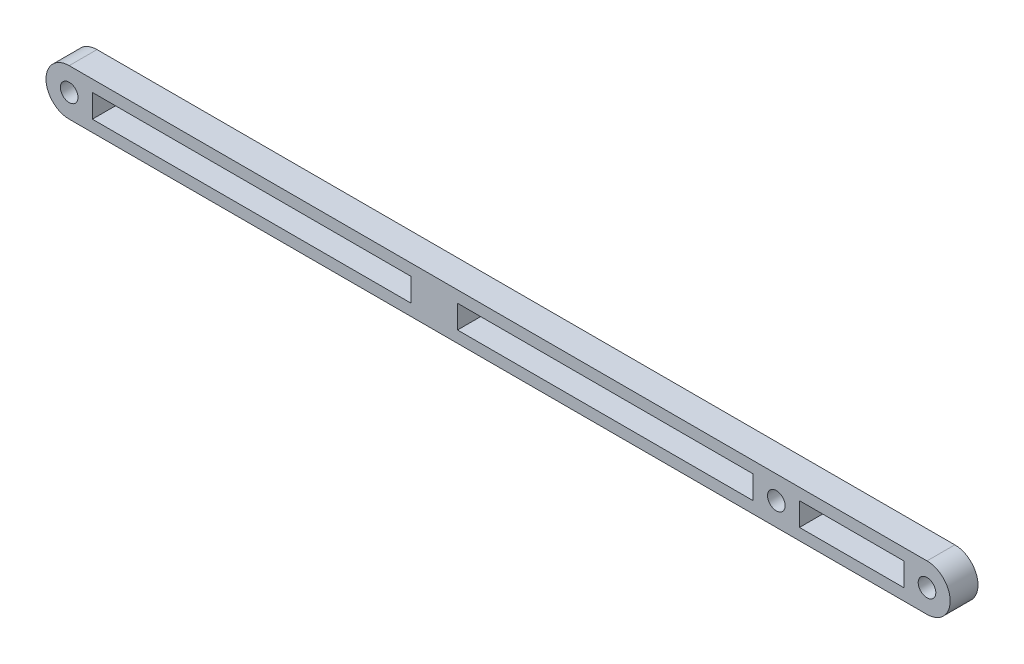
ISO-10303-21;
HEADER;
FILE_DESCRIPTION(('STEP AP214'),'2;1');
FILE_NAME('part.step','',(''),(''),'','','');
FILE_SCHEMA(('AUTOMOTIVE_DESIGN { 1 0 10303 214 1 1 1 1 }'));
ENDSEC;
DATA;
#1=APPLICATION_CONTEXT('core data for automotive mechanical design processes');
#2=APPLICATION_PROTOCOL_DEFINITION('international standard','automotive_design',2000,#1);
#3=PRODUCT_CONTEXT('',#1,'mechanical');
#4=PRODUCT('Part','Part','',(#3));
#5=PRODUCT_RELATED_PRODUCT_CATEGORY('part','',(#4));
#6=PRODUCT_DEFINITION_FORMATION('','',#4);
#7=PRODUCT_DEFINITION_CONTEXT('part definition',#1,'design');
#8=PRODUCT_DEFINITION('design','',#6,#7);
#9=PRODUCT_DEFINITION_SHAPE('','',#8);
#10=(LENGTH_UNIT() NAMED_UNIT(*) SI_UNIT(.MILLI.,.METRE.));
#11=(NAMED_UNIT(*) PLANE_ANGLE_UNIT() SI_UNIT($,.RADIAN.));
#12=(NAMED_UNIT(*) SI_UNIT($,.STERADIAN.) SOLID_ANGLE_UNIT());
#13=UNCERTAINTY_MEASURE_WITH_UNIT(LENGTH_MEASURE(1.E-05),#10,'distance_accuracy_value','');
#14=(GEOMETRIC_REPRESENTATION_CONTEXT(3) GLOBAL_UNCERTAINTY_ASSIGNED_CONTEXT((#13)) GLOBAL_UNIT_ASSIGNED_CONTEXT((#10,
#11,#12)) REPRESENTATION_CONTEXT('',''));
#15=CARTESIAN_POINT('',(0.,0.,0.));
#16=DIRECTION('',(0.,0.,1.));
#17=DIRECTION('',(1.,0.,0.));
#18=AXIS2_PLACEMENT_3D('',#15,#16,#17);
#19=CARTESIAN_POINT('',(-87.5,-2.49999999999997,0.));
#20=DIRECTION('',(0.,-1.,0.));
#21=DIRECTION('',(0.,0.,-1.));
#22=AXIS2_PLACEMENT_3D('',#19,#20,#21);
#23=PLANE('',#22);
#24=DIRECTION('',(1.,0.,0.));
#25=VECTOR('',#24,1.);
#26=CARTESIAN_POINT('',(-87.5,-2.49999999999997,6.));
#27=LINE('',#26,#25);
#28=CARTESIAN_POINT('',(-87.5,-2.49999999999997,6.));
#29=VERTEX_POINT('',#28);
#30=CARTESIAN_POINT('',(-18.75,-2.49999999999997,6.));
#31=VERTEX_POINT('',#30);
#32=EDGE_CURVE('E168',#29,#31,#27,.T.);
#33=ORIENTED_EDGE('',*,*,#32,.T.);
#34=DIRECTION('',(0.,0.,1.));
#35=VECTOR('',#34,1.);
#36=CARTESIAN_POINT('',(-18.75,-2.49999999999997,0.));
#37=LINE('',#36,#35);
#38=CARTESIAN_POINT('',(-18.75,-2.49999999999997,0.));
#39=VERTEX_POINT('',#38);
#40=EDGE_CURVE('E67',#39,#31,#37,.T.);
#41=ORIENTED_EDGE('',*,*,#40,.F.);
#42=DIRECTION('',(1.,0.,0.));
#43=VECTOR('',#42,1.);
#44=CARTESIAN_POINT('',(-87.5,-2.49999999999997,0.));
#45=LINE('',#44,#43);
#46=CARTESIAN_POINT('',(-87.5,-2.49999999999997,0.));
#47=VERTEX_POINT('',#46);
#48=EDGE_CURVE('E216',#47,#39,#45,.T.);
#49=ORIENTED_EDGE('',*,*,#48,.F.);
#50=DIRECTION('',(0.,0.,1.));
#51=VECTOR('',#50,1.);
#52=CARTESIAN_POINT('',(-87.5,-2.49999999999997,0.));
#53=LINE('',#52,#51);
#54=EDGE_CURVE('E235',#47,#29,#53,.T.);
#55=ORIENTED_EDGE('',*,*,#54,.T.);
#56=EDGE_LOOP('',(#33,#41,#49,#55));
#57=FACE_BOUND('',#56,.T.);
#58=ADVANCED_FACE('F43',(#57),#23,.F.);
#59=CARTESIAN_POINT('',(-87.5,2.50000000000003,0.));
#60=DIRECTION('',(0.,1.,0.));
#61=DIRECTION('',(0.,0.,1.));
#62=AXIS2_PLACEMENT_3D('',#59,#60,#61);
#63=PLANE('',#62);
#64=DIRECTION('',(-1.,0.,0.));
#65=VECTOR('',#64,1.);
#66=CARTESIAN_POINT('',(-87.5,2.50000000000003,0.));
#67=LINE('',#66,#65);
#68=CARTESIAN_POINT('',(-18.75,2.50000000000003,0.));
#69=VERTEX_POINT('',#68);
#70=CARTESIAN_POINT('',(-87.5,2.50000000000003,0.));
#71=VERTEX_POINT('',#70);
#72=EDGE_CURVE('E207',#69,#71,#67,.T.);
#73=ORIENTED_EDGE('',*,*,#72,.F.);
#74=DIRECTION('',(0.,0.,1.));
#75=VECTOR('',#74,1.);
#76=CARTESIAN_POINT('',(-18.75,2.50000000000003,0.));
#77=LINE('',#76,#75);
#78=CARTESIAN_POINT('',(-18.75,2.50000000000003,6.));
#79=VERTEX_POINT('',#78);
#80=EDGE_CURVE('E194',#69,#79,#77,.T.);
#81=ORIENTED_EDGE('',*,*,#80,.T.);
#82=DIRECTION('',(-1.,0.,0.));
#83=VECTOR('',#82,1.);
#84=CARTESIAN_POINT('',(-87.5,2.50000000000003,6.));
#85=LINE('',#84,#83);
#86=CARTESIAN_POINT('',(-87.5,2.50000000000003,6.));
#87=VERTEX_POINT('',#86);
#88=EDGE_CURVE('E222',#79,#87,#85,.T.);
#89=ORIENTED_EDGE('',*,*,#88,.T.);
#90=DIRECTION('',(0.,0.,1.));
#91=VECTOR('',#90,1.);
#92=CARTESIAN_POINT('',(-87.5,2.50000000000003,0.));
#93=LINE('',#92,#91);
#94=EDGE_CURVE('E238',#71,#87,#93,.T.);
#95=ORIENTED_EDGE('',*,*,#94,.F.);
#96=EDGE_LOOP('',(#73,#81,#89,#95));
#97=FACE_BOUND('',#96,.T.);
#98=ADVANCED_FACE('F374',(#97),#63,.F.);
#99=CARTESIAN_POINT('',(92.5,0.,6.));
#100=DIRECTION('',(0.,0.,-1.));
#101=DIRECTION('',(-1.,0.,0.));
#102=AXIS2_PLACEMENT_3D('',#99,#100,#101);
#103=PLANE('',#102);
#104=CARTESIAN_POINT('',(-8.74999999999999,-2.49999999999997,6.));
#105=VERTEX_POINT('',#104);
#106=CARTESIAN_POINT('',(55.,-2.49999999999997,6.));
#107=VERTEX_POINT('',#106);
#108=EDGE_CURVE('E159',#105,#107,#27,.T.);
#109=ORIENTED_EDGE('',*,*,#108,.F.);
#110=DIRECTION('',(0.,1.,0.));
#111=VECTOR('',#110,1.);
#112=CARTESIAN_POINT('',(-8.75,2.50000000000003,6.));
#113=LINE('',#112,#111);
#114=CARTESIAN_POINT('',(-8.74999999999999,2.50000000000003,6.));
#115=VERTEX_POINT('',#114);
#116=EDGE_CURVE('E164',#105,#115,#113,.T.);
#117=ORIENTED_EDGE('',*,*,#116,.T.);
#118=CARTESIAN_POINT('',(55.,2.50000000000003,6.));
#119=VERTEX_POINT('',#118);
#120=EDGE_CURVE('E224',#119,#115,#85,.T.);
#121=ORIENTED_EDGE('',*,*,#120,.F.);
#122=DIRECTION('',(0.,1.,0.));
#123=VECTOR('',#122,1.);
#124=CARTESIAN_POINT('',(55.,-2.49999999999997,6.));
#125=LINE('',#124,#123);
#126=EDGE_CURVE('E165',#107,#119,#125,.T.);
#127=ORIENTED_EDGE('',*,*,#126,.F.);
#128=EDGE_LOOP('',(#109,#117,#121,#127));
#129=FACE_BOUND('',#128,.T.);
#130=DIRECTION('',(0.,-1.,0.));
#131=VECTOR('',#130,1.);
#132=CARTESIAN_POINT('',(-18.75,2.50000000000003,6.));
#133=LINE('',#132,#131);
#134=EDGE_CURVE('E183',#79,#31,#133,.T.);
#135=ORIENTED_EDGE('',*,*,#134,.T.);
#136=ORIENTED_EDGE('',*,*,#32,.F.);
#137=DIRECTION('',(0.,-1.,0.));
#138=VECTOR('',#137,1.);
#139=CARTESIAN_POINT('',(-87.5,-2.49999999999997,6.));
#140=LINE('',#139,#138);
#141=EDGE_CURVE('E169',#87,#29,#140,.T.);
#142=ORIENTED_EDGE('',*,*,#141,.F.);
#143=ORIENTED_EDGE('',*,*,#88,.F.);
#144=EDGE_LOOP('',(#135,#136,#142,#143));
#145=FACE_BOUND('',#144,.T.);
#146=DIRECTION('',(-1.,0.,0.));
#147=VECTOR('',#146,1.);
#148=CARTESIAN_POINT('',(65.,2.50000000000003,6.));
#149=LINE('',#148,#147);
#150=CARTESIAN_POINT('',(87.5,2.50000000000003,6.));
#151=VERTEX_POINT('',#150);
#152=CARTESIAN_POINT('',(65.,2.50000000000003,6.));
#153=VERTEX_POINT('',#152);
#154=EDGE_CURVE('E267',#151,#153,#149,.T.);
#155=ORIENTED_EDGE('',*,*,#154,.F.);
#156=DIRECTION('',(0.,1.,0.));
#157=VECTOR('',#156,1.);
#158=CARTESIAN_POINT('',(87.5,-2.49999999999997,6.));
#159=LINE('',#158,#157);
#160=CARTESIAN_POINT('',(87.5,-2.49999999999997,6.));
#161=VERTEX_POINT('',#160);
#162=EDGE_CURVE('E223',#161,#151,#159,.T.);
#163=ORIENTED_EDGE('',*,*,#162,.F.);
#164=DIRECTION('',(1.,0.,0.));
#165=VECTOR('',#164,1.);
#166=CARTESIAN_POINT('',(65.,-2.49999999999997,6.));
#167=LINE('',#166,#165);
#168=CARTESIAN_POINT('',(65.,-2.49999999999997,6.));
#169=VERTEX_POINT('',#168);
#170=EDGE_CURVE('E258',#169,#161,#167,.T.);
#171=ORIENTED_EDGE('',*,*,#170,.F.);
#172=DIRECTION('',(0.,-1.,0.));
#173=VECTOR('',#172,1.);
#174=CARTESIAN_POINT('',(65.,-2.49999999999997,6.));
#175=LINE('',#174,#173);
#176=EDGE_CURVE('E262',#153,#169,#175,.T.);
#177=ORIENTED_EDGE('',*,*,#176,.F.);
#178=EDGE_LOOP('',(#155,#163,#171,#177));
#179=FACE_BOUND('',#178,.T.);
#180=CARTESIAN_POINT('',(92.5,0.,6.));
#181=DIRECTION('',(0.,0.,1.));
#182=DIRECTION('',(-1.,0.,0.));
#183=AXIS2_PLACEMENT_3D('',#180,#181,#182);
#184=CIRCLE('',#183,5.00000000000003);
#185=CARTESIAN_POINT('',(92.5,-5.00000000000003,6.));
#186=VERTEX_POINT('',#185);
#187=CARTESIAN_POINT('',(92.5,5.00000000000003,6.));
#188=VERTEX_POINT('',#187);
#189=EDGE_CURVE('E311',#186,#188,#184,.T.);
#190=ORIENTED_EDGE('',*,*,#189,.T.);
#191=DIRECTION('',(-1.,0.,0.));
#192=VECTOR('',#191,1.);
#193=CARTESIAN_POINT('',(-92.5,5.,6.));
#194=LINE('',#193,#192);
#195=CARTESIAN_POINT('',(-92.5,5.00000000000001,6.));
#196=VERTEX_POINT('',#195);
#197=EDGE_CURVE('E315',#188,#196,#194,.T.);
#198=ORIENTED_EDGE('',*,*,#197,.T.);
#199=CARTESIAN_POINT('',(-92.5,0.,6.));
#200=DIRECTION('',(0.,0.,1.));
#201=DIRECTION('',(1.,0.,0.));
#202=AXIS2_PLACEMENT_3D('',#199,#200,#201);
#203=CIRCLE('',#202,5.00000000000003);
#204=CARTESIAN_POINT('',(-92.5,-5.00000000000007,6.));
#205=VERTEX_POINT('',#204);
#206=EDGE_CURVE('E319',#196,#205,#203,.T.);
#207=ORIENTED_EDGE('',*,*,#206,.T.);
#208=DIRECTION('',(1.,0.,0.));
#209=VECTOR('',#208,1.);
#210=CARTESIAN_POINT('',(-92.5,-5.00000000000007,6.));
#211=LINE('',#210,#209);
#212=EDGE_CURVE('E322',#205,#186,#211,.T.);
#213=ORIENTED_EDGE('',*,*,#212,.T.);
#214=EDGE_LOOP('',(#190,#198,#207,#213));
#215=FACE_BOUND('',#214,.T.);
#216=CARTESIAN_POINT('',(-92.5,0.,6.));
#217=DIRECTION('',(0.,0.,1.));
#218=DIRECTION('',(1.,0.,0.));
#219=AXIS2_PLACEMENT_3D('',#216,#217,#218);
#220=CIRCLE('',#219,1.9);
#221=CARTESIAN_POINT('',(-90.6,0.,6.));
#222=VERTEX_POINT('',#221);
#223=EDGE_CURVE('E303',#222,#222,#220,.T.);
#224=ORIENTED_EDGE('',*,*,#223,.F.);
#225=EDGE_LOOP('',(#224));
#226=FACE_BOUND('',#225,.T.);
#227=CARTESIAN_POINT('',(92.5,0.,6.));
#228=DIRECTION('',(0.,0.,1.));
#229=DIRECTION('',(1.,0.,0.));
#230=AXIS2_PLACEMENT_3D('',#227,#228,#229);
#231=CIRCLE('',#230,1.9);
#232=CARTESIAN_POINT('',(94.4,0.,6.));
#233=VERTEX_POINT('',#232);
#234=EDGE_CURVE('E295',#233,#233,#231,.T.);
#235=ORIENTED_EDGE('',*,*,#234,.F.);
#236=EDGE_LOOP('',(#235));
#237=FACE_BOUND('',#236,.T.);
#238=CARTESIAN_POINT('',(60.,0.,6.));
#239=DIRECTION('',(0.,0.,1.));
#240=DIRECTION('',(1.,0.,0.));
#241=AXIS2_PLACEMENT_3D('',#238,#239,#240);
#242=CIRCLE('',#241,1.9);
#243=CARTESIAN_POINT('',(61.9,0.,6.));
#244=VERTEX_POINT('',#243);
#245=EDGE_CURVE('E287',#244,#244,#242,.T.);
#246=ORIENTED_EDGE('',*,*,#245,.F.);
#247=EDGE_LOOP('',(#246));
#248=FACE_BOUND('',#247,.T.);
#249=ADVANCED_FACE('F160',(#129,#145,#179,#215,#226,#237,#248),#103,.F.);
#250=CARTESIAN_POINT('',(92.5,0.,0.));
#251=DIRECTION('',(0.,0.,-1.));
#252=DIRECTION('',(-1.,0.,0.));
#253=AXIS2_PLACEMENT_3D('',#250,#251,#252);
#254=PLANE('',#253);
#255=DIRECTION('',(0.,1.,0.));
#256=VECTOR('',#255,1.);
#257=CARTESIAN_POINT('',(-8.75,2.50000000000003,0.));
#258=LINE('',#257,#256);
#259=CARTESIAN_POINT('',(-8.74999999999999,-2.49999999999997,0.));
#260=VERTEX_POINT('',#259);
#261=CARTESIAN_POINT('',(-8.74999999999999,2.50000000000003,0.));
#262=VERTEX_POINT('',#261);
#263=EDGE_CURVE('E188',#260,#262,#258,.T.);
#264=ORIENTED_EDGE('',*,*,#263,.F.);
#265=CARTESIAN_POINT('',(55.,-2.49999999999997,0.));
#266=VERTEX_POINT('',#265);
#267=EDGE_CURVE('E59',#260,#266,#45,.T.);
#268=ORIENTED_EDGE('',*,*,#267,.T.);
#269=DIRECTION('',(0.,1.,0.));
#270=VECTOR('',#269,1.);
#271=CARTESIAN_POINT('',(55.,-2.49999999999997,0.));
#272=LINE('',#271,#270);
#273=CARTESIAN_POINT('',(55.,2.50000000000003,0.));
#274=VERTEX_POINT('',#273);
#275=EDGE_CURVE('E203',#266,#274,#272,.T.);
#276=ORIENTED_EDGE('',*,*,#275,.T.);
#277=EDGE_CURVE('E208',#274,#262,#67,.T.);
#278=ORIENTED_EDGE('',*,*,#277,.T.);
#279=EDGE_LOOP('',(#264,#268,#276,#278));
#280=FACE_BOUND('',#279,.T.);
#281=ORIENTED_EDGE('',*,*,#48,.T.);
#282=DIRECTION('',(0.,-1.,0.));
#283=VECTOR('',#282,1.);
#284=CARTESIAN_POINT('',(-18.75,2.50000000000003,0.));
#285=LINE('',#284,#283);
#286=EDGE_CURVE('E182',#69,#39,#285,.T.);
#287=ORIENTED_EDGE('',*,*,#286,.F.);
#288=ORIENTED_EDGE('',*,*,#72,.T.);
#289=DIRECTION('',(0.,-1.,0.));
#290=VECTOR('',#289,1.);
#291=CARTESIAN_POINT('',(-87.5,-2.49999999999997,0.));
#292=LINE('',#291,#290);
#293=EDGE_CURVE('E212',#71,#47,#292,.T.);
#294=ORIENTED_EDGE('',*,*,#293,.T.);
#295=EDGE_LOOP('',(#281,#287,#288,#294));
#296=FACE_BOUND('',#295,.T.);
#297=DIRECTION('',(0.,1.,0.));
#298=VECTOR('',#297,1.);
#299=CARTESIAN_POINT('',(87.5,-2.49999999999997,0.));
#300=LINE('',#299,#298);
#301=CARTESIAN_POINT('',(87.5,-2.49999999999997,0.));
#302=VERTEX_POINT('',#301);
#303=CARTESIAN_POINT('',(87.5,2.50000000000003,0.));
#304=VERTEX_POINT('',#303);
#305=EDGE_CURVE('E263',#302,#304,#300,.T.);
#306=ORIENTED_EDGE('',*,*,#305,.T.);
#307=DIRECTION('',(-1.,0.,0.));
#308=VECTOR('',#307,1.);
#309=CARTESIAN_POINT('',(65.,2.50000000000003,0.));
#310=LINE('',#309,#308);
#311=CARTESIAN_POINT('',(65.,2.50000000000003,0.));
#312=VERTEX_POINT('',#311);
#313=EDGE_CURVE('E280',#304,#312,#310,.T.);
#314=ORIENTED_EDGE('',*,*,#313,.T.);
#315=DIRECTION('',(0.,-1.,0.));
#316=VECTOR('',#315,1.);
#317=CARTESIAN_POINT('',(65.,-2.49999999999997,0.));
#318=LINE('',#317,#316);
#319=CARTESIAN_POINT('',(65.,-2.49999999999997,0.));
#320=VERTEX_POINT('',#319);
#321=EDGE_CURVE('E276',#312,#320,#318,.T.);
#322=ORIENTED_EDGE('',*,*,#321,.T.);
#323=DIRECTION('',(1.,0.,0.));
#324=VECTOR('',#323,1.);
#325=CARTESIAN_POINT('',(65.,-2.49999999999997,0.));
#326=LINE('',#325,#324);
#327=EDGE_CURVE('E249',#320,#302,#326,.T.);
#328=ORIENTED_EDGE('',*,*,#327,.T.);
#329=EDGE_LOOP('',(#306,#314,#322,#328));
#330=FACE_BOUND('',#329,.T.);
#331=CARTESIAN_POINT('',(92.5,0.,0.));
#332=DIRECTION('',(0.,0.,1.));
#333=DIRECTION('',(1.,0.,0.));
#334=AXIS2_PLACEMENT_3D('',#331,#332,#333);
#335=CIRCLE('',#334,1.9);
#336=CARTESIAN_POINT('',(94.4,0.,0.));
#337=VERTEX_POINT('',#336);
#338=EDGE_CURVE('E291',#337,#337,#335,.T.);
#339=ORIENTED_EDGE('',*,*,#338,.T.);
#340=EDGE_LOOP('',(#339));
#341=FACE_BOUND('',#340,.T.);
#342=CARTESIAN_POINT('',(92.5,0.,0.));
#343=DIRECTION('',(0.,0.,1.));
#344=DIRECTION('',(-1.,0.,0.));
#345=AXIS2_PLACEMENT_3D('',#342,#343,#344);
#346=CIRCLE('',#345,5.00000000000003);
#347=CARTESIAN_POINT('',(92.5,-5.00000000000003,0.));
#348=VERTEX_POINT('',#347);
#349=CARTESIAN_POINT('',(92.5,5.00000000000003,0.));
#350=VERTEX_POINT('',#349);
#351=EDGE_CURVE('E307',#348,#350,#346,.T.);
#352=ORIENTED_EDGE('',*,*,#351,.F.);
#353=DIRECTION('',(1.,0.,0.));
#354=VECTOR('',#353,1.);
#355=CARTESIAN_POINT('',(-92.5,-5.00000000000007,0.));
#356=LINE('',#355,#354);
#357=CARTESIAN_POINT('',(-92.5,-5.00000000000007,0.));
#358=VERTEX_POINT('',#357);
#359=EDGE_CURVE('E316',#358,#348,#356,.T.);
#360=ORIENTED_EDGE('',*,*,#359,.F.);
#361=CARTESIAN_POINT('',(-92.5,0.,0.));
#362=DIRECTION('',(0.,0.,1.));
#363=DIRECTION('',(1.,0.,0.));
#364=AXIS2_PLACEMENT_3D('',#361,#362,#363);
#365=CIRCLE('',#364,5.00000000000003);
#366=CARTESIAN_POINT('',(-92.5,5.00000000000001,0.));
#367=VERTEX_POINT('',#366);
#368=EDGE_CURVE('E332',#367,#358,#365,.T.);
#369=ORIENTED_EDGE('',*,*,#368,.F.);
#370=DIRECTION('',(-1.,0.,0.));
#371=VECTOR('',#370,1.);
#372=CARTESIAN_POINT('',(-92.5,5.,0.));
#373=LINE('',#372,#371);
#374=EDGE_CURVE('E329',#350,#367,#373,.T.);
#375=ORIENTED_EDGE('',*,*,#374,.F.);
#376=EDGE_LOOP('',(#352,#360,#369,#375));
#377=FACE_BOUND('',#376,.T.);
#378=CARTESIAN_POINT('',(-92.5,0.,0.));
#379=DIRECTION('',(0.,0.,1.));
#380=DIRECTION('',(1.,0.,0.));
#381=AXIS2_PLACEMENT_3D('',#378,#379,#380);
#382=CIRCLE('',#381,1.9);
#383=CARTESIAN_POINT('',(-90.6,0.,0.));
#384=VERTEX_POINT('',#383);
#385=EDGE_CURVE('E299',#384,#384,#382,.T.);
#386=ORIENTED_EDGE('',*,*,#385,.T.);
#387=EDGE_LOOP('',(#386));
#388=FACE_BOUND('',#387,.T.);
#389=CARTESIAN_POINT('',(60.,0.,0.));
#390=DIRECTION('',(0.,0.,1.));
#391=DIRECTION('',(1.,0.,0.));
#392=AXIS2_PLACEMENT_3D('',#389,#390,#391);
#393=CIRCLE('',#392,1.9);
#394=CARTESIAN_POINT('',(61.9,0.,0.));
#395=VERTEX_POINT('',#394);
#396=EDGE_CURVE('E234',#395,#395,#393,.T.);
#397=ORIENTED_EDGE('',*,*,#396,.T.);
#398=EDGE_LOOP('',(#397));
#399=FACE_BOUND('',#398,.T.);
#400=ADVANCED_FACE('F355',(#280,#296,#330,#341,#377,#388,#399),#254,.T.);
#401=CARTESIAN_POINT('',(92.5,0.,6.));
#402=DIRECTION('',(0.,0.,-1.));
#403=DIRECTION('',(-1.,0.,0.));
#404=AXIS2_PLACEMENT_3D('',#401,#402,#403);
#405=CYLINDRICAL_SURFACE('',#404,5.00000000000003);
#406=ORIENTED_EDGE('',*,*,#351,.T.);
#407=DIRECTION('',(0.,0.,-1.));
#408=VECTOR('',#407,1.);
#409=CARTESIAN_POINT('',(92.5,5.00000000000003,6.));
#410=LINE('',#409,#408);
#411=EDGE_CURVE('E11',#188,#350,#410,.T.);
#412=ORIENTED_EDGE('',*,*,#411,.F.);
#413=ORIENTED_EDGE('',*,*,#189,.F.);
#414=DIRECTION('',(0.,0.,-1.));
#415=VECTOR('',#414,1.);
#416=CARTESIAN_POINT('',(92.5,-5.00000000000003,6.));
#417=LINE('',#416,#415);
#418=EDGE_CURVE('E325',#186,#348,#417,.T.);
#419=ORIENTED_EDGE('',*,*,#418,.T.);
#420=EDGE_LOOP('',(#406,#412,#413,#419));
#421=FACE_BOUND('',#420,.T.);
#422=ADVANCED_FACE('F45',(#421),#405,.T.);
#423=CARTESIAN_POINT('',(-92.5,5.,6.));
#424=DIRECTION('',(0.,-1.,0.));
#425=DIRECTION('',(1.,0.,0.));
#426=AXIS2_PLACEMENT_3D('',#423,#424,#425);
#427=PLANE('',#426);
#428=ORIENTED_EDGE('',*,*,#374,.T.);
#429=DIRECTION('',(0.,0.,-1.));
#430=VECTOR('',#429,1.);
#431=CARTESIAN_POINT('',(-92.5,5.00000000000001,6.));
#432=LINE('',#431,#430);
#433=EDGE_CURVE('E52',#196,#367,#432,.T.);
#434=ORIENTED_EDGE('',*,*,#433,.F.);
#435=ORIENTED_EDGE('',*,*,#197,.F.);
#436=ORIENTED_EDGE('',*,*,#411,.T.);
#437=EDGE_LOOP('',(#428,#434,#435,#436));
#438=FACE_BOUND('',#437,.T.);
#439=ADVANCED_FACE('F366',(#438),#427,.F.);
#440=CARTESIAN_POINT('',(-92.5,0.,6.));
#441=DIRECTION('',(0.,0.,-1.));
#442=DIRECTION('',(-1.,0.,0.));
#443=AXIS2_PLACEMENT_3D('',#440,#441,#442);
#444=CYLINDRICAL_SURFACE('',#443,5.00000000000003);
#445=ORIENTED_EDGE('',*,*,#368,.T.);
#446=DIRECTION('',(0.,0.,-1.));
#447=VECTOR('',#446,1.);
#448=CARTESIAN_POINT('',(-92.5,-5.00000000000007,6.));
#449=LINE('',#448,#447);
#450=EDGE_CURVE('E340',#205,#358,#449,.T.);
#451=ORIENTED_EDGE('',*,*,#450,.F.);
#452=ORIENTED_EDGE('',*,*,#206,.F.);
#453=ORIENTED_EDGE('',*,*,#433,.T.);
#454=EDGE_LOOP('',(#445,#451,#452,#453));
#455=FACE_BOUND('',#454,.T.);
#456=ADVANCED_FACE('F349',(#455),#444,.T.);
#457=CARTESIAN_POINT('',(-92.5,-5.00000000000007,6.));
#458=DIRECTION('',(0.,1.,0.));
#459=DIRECTION('',(-1.,0.,0.));
#460=AXIS2_PLACEMENT_3D('',#457,#458,#459);
#461=PLANE('',#460);
#462=ORIENTED_EDGE('',*,*,#359,.T.);
#463=ORIENTED_EDGE('',*,*,#418,.F.);
#464=ORIENTED_EDGE('',*,*,#212,.F.);
#465=ORIENTED_EDGE('',*,*,#450,.T.);
#466=EDGE_LOOP('',(#462,#463,#464,#465));
#467=FACE_BOUND('',#466,.T.);
#468=ADVANCED_FACE('F359',(#467),#461,.F.);
#469=CARTESIAN_POINT('',(-92.5,0.,6.));
#470=DIRECTION('',(0.,0.,-1.));
#471=DIRECTION('',(-1.,0.,0.));
#472=AXIS2_PLACEMENT_3D('',#469,#470,#471);
#473=CYLINDRICAL_SURFACE('',#472,1.9);
#474=ORIENTED_EDGE('',*,*,#223,.T.);
#475=EDGE_LOOP('',(#474));
#476=FACE_BOUND('',#475,.T.);
#477=ORIENTED_EDGE('',*,*,#385,.F.);
#478=EDGE_LOOP('',(#477));
#479=FACE_BOUND('',#478,.T.);
#480=ADVANCED_FACE('F423',(#476,#479),#473,.F.);
#481=CARTESIAN_POINT('',(92.5,0.,6.));
#482=DIRECTION('',(0.,0.,-1.));
#483=DIRECTION('',(-1.,0.,0.));
#484=AXIS2_PLACEMENT_3D('',#481,#482,#483);
#485=CYLINDRICAL_SURFACE('',#484,1.9);
#486=ORIENTED_EDGE('',*,*,#234,.T.);
#487=EDGE_LOOP('',(#486));
#488=FACE_BOUND('',#487,.T.);
#489=ORIENTED_EDGE('',*,*,#338,.F.);
#490=EDGE_LOOP('',(#489));
#491=FACE_BOUND('',#490,.T.);
#492=ADVANCED_FACE('F419',(#488,#491),#485,.F.);
#493=CARTESIAN_POINT('',(60.,0.,6.));
#494=DIRECTION('',(0.,0.,-1.));
#495=DIRECTION('',(-1.,0.,0.));
#496=AXIS2_PLACEMENT_3D('',#493,#494,#495);
#497=CYLINDRICAL_SURFACE('',#496,1.9);
#498=ORIENTED_EDGE('',*,*,#245,.T.);
#499=EDGE_LOOP('',(#498));
#500=FACE_BOUND('',#499,.T.);
#501=ORIENTED_EDGE('',*,*,#396,.F.);
#502=EDGE_LOOP('',(#501));
#503=FACE_BOUND('',#502,.T.);
#504=ADVANCED_FACE('F408',(#500,#503),#497,.F.);
#505=CARTESIAN_POINT('',(87.5,-2.49999999999997,0.));
#506=DIRECTION('',(1.,0.,0.));
#507=DIRECTION('',(0.,0.,-1.));
#508=AXIS2_PLACEMENT_3D('',#505,#506,#507);
#509=PLANE('',#508);
#510=ORIENTED_EDGE('',*,*,#162,.T.);
#511=DIRECTION('',(0.,0.,1.));
#512=VECTOR('',#511,1.);
#513=CARTESIAN_POINT('',(87.5,2.50000000000003,0.));
#514=LINE('',#513,#512);
#515=EDGE_CURVE('E245',#304,#151,#514,.T.);
#516=ORIENTED_EDGE('',*,*,#515,.F.);
#517=ORIENTED_EDGE('',*,*,#305,.F.);
#518=DIRECTION('',(0.,0.,1.));
#519=VECTOR('',#518,1.);
#520=CARTESIAN_POINT('',(87.5,-2.49999999999997,0.));
#521=LINE('',#520,#519);
#522=EDGE_CURVE('E198',#302,#161,#521,.T.);
#523=ORIENTED_EDGE('',*,*,#522,.T.);
#524=EDGE_LOOP('',(#510,#516,#517,#523));
#525=FACE_BOUND('',#524,.T.);
#526=ADVANCED_FACE('F405',(#525),#509,.F.);
#527=CARTESIAN_POINT('',(65.,-2.49999999999997,0.));
#528=DIRECTION('',(0.,-1.,0.));
#529=DIRECTION('',(0.,0.,-1.));
#530=AXIS2_PLACEMENT_3D('',#527,#528,#529);
#531=PLANE('',#530);
#532=ORIENTED_EDGE('',*,*,#170,.T.);
#533=ORIENTED_EDGE('',*,*,#522,.F.);
#534=ORIENTED_EDGE('',*,*,#327,.F.);
#535=DIRECTION('',(0.,0.,1.));
#536=VECTOR('',#535,1.);
#537=CARTESIAN_POINT('',(65.,-2.49999999999997,0.));
#538=LINE('',#537,#536);
#539=EDGE_CURVE('E253',#320,#169,#538,.T.);
#540=ORIENTED_EDGE('',*,*,#539,.T.);
#541=EDGE_LOOP('',(#532,#533,#534,#540));
#542=FACE_BOUND('',#541,.T.);
#543=ADVANCED_FACE('F407',(#542),#531,.F.);
#544=CARTESIAN_POINT('',(65.,-2.49999999999997,0.));
#545=DIRECTION('',(-1.,0.,0.));
#546=DIRECTION('',(0.,0.,1.));
#547=AXIS2_PLACEMENT_3D('',#544,#545,#546);
#548=PLANE('',#547);
#549=ORIENTED_EDGE('',*,*,#176,.T.);
#550=ORIENTED_EDGE('',*,*,#539,.F.);
#551=ORIENTED_EDGE('',*,*,#321,.F.);
#552=DIRECTION('',(0.,0.,1.));
#553=VECTOR('',#552,1.);
#554=CARTESIAN_POINT('',(65.,2.50000000000003,0.));
#555=LINE('',#554,#553);
#556=EDGE_CURVE('E250',#312,#153,#555,.T.);
#557=ORIENTED_EDGE('',*,*,#556,.T.);
#558=EDGE_LOOP('',(#549,#550,#551,#557));
#559=FACE_BOUND('',#558,.T.);
#560=ADVANCED_FACE('F401',(#559),#548,.F.);
#561=CARTESIAN_POINT('',(65.,2.50000000000003,0.));
#562=DIRECTION('',(0.,1.,0.));
#563=DIRECTION('',(0.,0.,1.));
#564=AXIS2_PLACEMENT_3D('',#561,#562,#563);
#565=PLANE('',#564);
#566=ORIENTED_EDGE('',*,*,#154,.T.);
#567=ORIENTED_EDGE('',*,*,#556,.F.);
#568=ORIENTED_EDGE('',*,*,#313,.F.);
#569=ORIENTED_EDGE('',*,*,#515,.T.);
#570=EDGE_LOOP('',(#566,#567,#568,#569));
#571=FACE_BOUND('',#570,.T.);
#572=ADVANCED_FACE('F395',(#571),#565,.F.);
#573=CARTESIAN_POINT('',(55.,-2.49999999999997,0.));
#574=DIRECTION('',(1.,0.,0.));
#575=DIRECTION('',(0.,0.,-1.));
#576=AXIS2_PLACEMENT_3D('',#573,#574,#575);
#577=PLANE('',#576);
#578=ORIENTED_EDGE('',*,*,#126,.T.);
#579=DIRECTION('',(0.,0.,1.));
#580=VECTOR('',#579,1.);
#581=CARTESIAN_POINT('',(55.,2.50000000000003,0.));
#582=LINE('',#581,#580);
#583=EDGE_CURVE('E219',#274,#119,#582,.T.);
#584=ORIENTED_EDGE('',*,*,#583,.F.);
#585=ORIENTED_EDGE('',*,*,#275,.F.);
#586=DIRECTION('',(0.,0.,1.));
#587=VECTOR('',#586,1.);
#588=CARTESIAN_POINT('',(55.,-2.49999999999997,0.));
#589=LINE('',#588,#587);
#590=EDGE_CURVE('E231',#266,#107,#589,.T.);
#591=ORIENTED_EDGE('',*,*,#590,.T.);
#592=EDGE_LOOP('',(#578,#584,#585,#591));
#593=FACE_BOUND('',#592,.T.);
#594=ADVANCED_FACE('F387',(#593),#577,.F.);
#595=ORIENTED_EDGE('',*,*,#267,.F.);
#596=DIRECTION('',(0.,0.,1.));
#597=VECTOR('',#596,1.);
#598=CARTESIAN_POINT('',(-8.74999999999999,-2.49999999999997,0.));
#599=LINE('',#598,#597);
#600=EDGE_CURVE('E171',#260,#105,#599,.T.);
#601=ORIENTED_EDGE('',*,*,#600,.T.);
#602=ORIENTED_EDGE('',*,*,#108,.T.);
#603=ORIENTED_EDGE('',*,*,#590,.F.);
#604=EDGE_LOOP('',(#595,#601,#602,#603));
#605=FACE_BOUND('',#604,.T.);
#606=ADVANCED_FACE('F172',(#605),#23,.F.);
#607=CARTESIAN_POINT('',(-87.5,-2.49999999999997,0.));
#608=DIRECTION('',(-1.,0.,0.));
#609=DIRECTION('',(0.,0.,1.));
#610=AXIS2_PLACEMENT_3D('',#607,#608,#609);
#611=PLANE('',#610);
#612=ORIENTED_EDGE('',*,*,#141,.T.);
#613=ORIENTED_EDGE('',*,*,#54,.F.);
#614=ORIENTED_EDGE('',*,*,#293,.F.);
#615=ORIENTED_EDGE('',*,*,#94,.T.);
#616=EDGE_LOOP('',(#612,#613,#614,#615));
#617=FACE_BOUND('',#616,.T.);
#618=ADVANCED_FACE('F386',(#617),#611,.F.);
#619=ORIENTED_EDGE('',*,*,#120,.T.);
#620=DIRECTION('',(0.,0.,1.));
#621=VECTOR('',#620,1.);
#622=CARTESIAN_POINT('',(-8.75,2.50000000000003,0.));
#623=LINE('',#622,#621);
#624=EDGE_CURVE('E177',#262,#115,#623,.T.);
#625=ORIENTED_EDGE('',*,*,#624,.F.);
#626=ORIENTED_EDGE('',*,*,#277,.F.);
#627=ORIENTED_EDGE('',*,*,#583,.T.);
#628=EDGE_LOOP('',(#619,#625,#626,#627));
#629=FACE_BOUND('',#628,.T.);
#630=ADVANCED_FACE('F382',(#629),#63,.F.);
#631=CARTESIAN_POINT('',(-18.75,2.50000000000003,0.));
#632=DIRECTION('',(-1.,0.,0.));
#633=DIRECTION('',(0.,0.,1.));
#634=AXIS2_PLACEMENT_3D('',#631,#632,#633);
#635=PLANE('',#634);
#636=ORIENTED_EDGE('',*,*,#134,.F.);
#637=ORIENTED_EDGE('',*,*,#80,.F.);
#638=ORIENTED_EDGE('',*,*,#286,.T.);
#639=ORIENTED_EDGE('',*,*,#40,.T.);
#640=EDGE_LOOP('',(#636,#637,#638,#639));
#641=FACE_BOUND('',#640,.T.);
#642=ADVANCED_FACE('F488',(#641),#635,.T.);
#643=CARTESIAN_POINT('',(-8.75,2.50000000000003,0.));
#644=DIRECTION('',(1.,0.,0.));
#645=DIRECTION('',(0.,1.,0.));
#646=AXIS2_PLACEMENT_3D('',#643,#644,#645);
#647=PLANE('',#646);
#648=ORIENTED_EDGE('',*,*,#116,.F.);
#649=ORIENTED_EDGE('',*,*,#600,.F.);
#650=ORIENTED_EDGE('',*,*,#263,.T.);
#651=ORIENTED_EDGE('',*,*,#624,.T.);
#652=EDGE_LOOP('',(#648,#649,#650,#651));
#653=FACE_BOUND('',#652,.T.);
#654=ADVANCED_FACE('F180',(#653),#647,.T.);
#655=CLOSED_SHELL('',(#58,#98,#249,#400,#422,#439,#456,#468,#480,#492,#504,#526,#543,#560,#572,
#594,#606,#618,#630,#642,#654));
#656=MANIFOLD_SOLID_BREP('B2',#655);
#657=ADVANCED_BREP_SHAPE_REPRESENTATION('',(#18,#656),#14);
#658=SHAPE_DEFINITION_REPRESENTATION(#9,#657);
ENDSEC;
END-ISO-10303-21;
